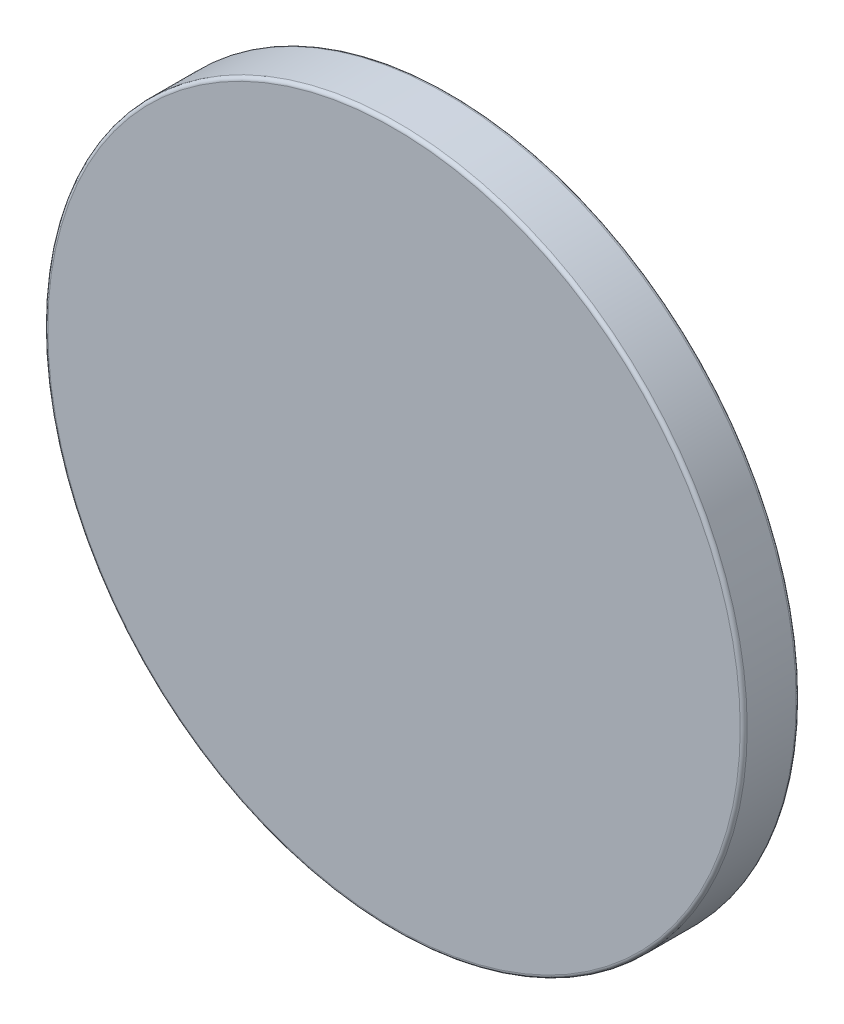
ISO-10303-21;
HEADER;
FILE_DESCRIPTION(('STEP AP214'),'2;1');
FILE_NAME('part.step','',(''),(''),'','','');
FILE_SCHEMA(('AUTOMOTIVE_DESIGN { 1 0 10303 214 1 1 1 1 }'));
ENDSEC;
DATA;
#1=APPLICATION_CONTEXT('core data for automotive mechanical design processes');
#2=APPLICATION_PROTOCOL_DEFINITION('international standard','automotive_design',2000,#1);
#3=PRODUCT_CONTEXT('',#1,'mechanical');
#4=PRODUCT('Part','Part','',(#3));
#5=PRODUCT_RELATED_PRODUCT_CATEGORY('part','',(#4));
#6=PRODUCT_DEFINITION_FORMATION('','',#4);
#7=PRODUCT_DEFINITION_CONTEXT('part definition',#1,'design');
#8=PRODUCT_DEFINITION('design','',#6,#7);
#9=PRODUCT_DEFINITION_SHAPE('','',#8);
#10=(LENGTH_UNIT() NAMED_UNIT(*) SI_UNIT(.MILLI.,.METRE.));
#11=(NAMED_UNIT(*) PLANE_ANGLE_UNIT() SI_UNIT($,.RADIAN.));
#12=(NAMED_UNIT(*) SI_UNIT($,.STERADIAN.) SOLID_ANGLE_UNIT());
#13=UNCERTAINTY_MEASURE_WITH_UNIT(LENGTH_MEASURE(1.E-05),#10,'distance_accuracy_value','');
#14=(GEOMETRIC_REPRESENTATION_CONTEXT(3) GLOBAL_UNCERTAINTY_ASSIGNED_CONTEXT((#13)) GLOBAL_UNIT_ASSIGNED_CONTEXT((#10,
#11,#12)) REPRESENTATION_CONTEXT('',''));
#15=CARTESIAN_POINT('',(0.,0.,0.));
#16=DIRECTION('',(0.,0.,1.));
#17=DIRECTION('',(1.,0.,0.));
#18=AXIS2_PLACEMENT_3D('',#15,#16,#17);
#19=CARTESIAN_POINT('',(0.,0.,1.016));
#20=DIRECTION('',(0.,0.,-1.));
#21=DIRECTION('',(-1.,0.,0.));
#22=AXIS2_PLACEMENT_3D('',#19,#20,#21);
#23=CYLINDRICAL_SURFACE('',#22,12.7);
#24=CARTESIAN_POINT('',(0.,0.,-0.888999999999999));
#25=DIRECTION('',(0.,0.,1.));
#26=DIRECTION('',(1.,0.,0.));
#27=AXIS2_PLACEMENT_3D('',#24,#25,#26);
#28=CIRCLE('',#27,12.7);
#29=CARTESIAN_POINT('',(12.7,0.,-0.888999999999999));
#30=VERTEX_POINT('',#29);
#31=EDGE_CURVE('E46',#30,#30,#28,.T.);
#32=ORIENTED_EDGE('',*,*,#31,.T.);
#33=EDGE_LOOP('',(#32));
#34=FACE_BOUND('',#33,.T.);
#35=CARTESIAN_POINT('',(0.,0.,0.889000000000001));
#36=DIRECTION('',(0.,0.,1.));
#37=DIRECTION('',(1.,0.,0.));
#38=AXIS2_PLACEMENT_3D('',#35,#36,#37);
#39=CIRCLE('',#38,12.7);
#40=CARTESIAN_POINT('',(12.7,0.,0.889000000000001));
#41=VERTEX_POINT('',#40);
#42=EDGE_CURVE('E50',#41,#41,#39,.F.);
#43=ORIENTED_EDGE('',*,*,#42,.T.);
#44=EDGE_LOOP('',(#43));
#45=FACE_BOUND('',#44,.T.);
#46=ADVANCED_FACE('F35',(#34,#45),#23,.T.);
#47=CARTESIAN_POINT('',(0.,0.,1.016));
#48=DIRECTION('',(0.,0.,1.));
#49=DIRECTION('',(1.,0.,0.));
#50=AXIS2_PLACEMENT_3D('',#47,#48,#49);
#51=PLANE('',#50);
#52=CARTESIAN_POINT('',(0.,0.,1.016));
#53=DIRECTION('',(0.,0.,1.));
#54=DIRECTION('',(1.,0.,0.));
#55=AXIS2_PLACEMENT_3D('',#52,#53,#54);
#56=CIRCLE('',#55,12.573);
#57=CARTESIAN_POINT('',(12.573,0.,1.016));
#58=VERTEX_POINT('',#57);
#59=EDGE_CURVE('E10',#58,#58,#56,.T.);
#60=ORIENTED_EDGE('',*,*,#59,.T.);
#61=EDGE_LOOP('',(#60));
#62=FACE_BOUND('',#61,.T.);
#63=ADVANCED_FACE('F66',(#62),#51,.T.);
#64=CARTESIAN_POINT('',(0.,0.,-1.016));
#65=DIRECTION('',(0.,0.,1.));
#66=DIRECTION('',(1.,0.,0.));
#67=AXIS2_PLACEMENT_3D('',#64,#65,#66);
#68=PLANE('',#67);
#69=CARTESIAN_POINT('',(0.,0.,-1.016));
#70=DIRECTION('',(0.,0.,1.));
#71=DIRECTION('',(1.,0.,0.));
#72=AXIS2_PLACEMENT_3D('',#69,#70,#71);
#73=CIRCLE('',#72,12.573);
#74=CARTESIAN_POINT('',(12.573,0.,-1.016));
#75=VERTEX_POINT('',#74);
#76=EDGE_CURVE('E42',#75,#75,#73,.F.);
#77=ORIENTED_EDGE('',*,*,#76,.T.);
#78=EDGE_LOOP('',(#77));
#79=FACE_BOUND('',#78,.T.);
#80=ADVANCED_FACE('F63',(#79),#68,.F.);
#81=CARTESIAN_POINT('',(0.,0.,-0.888999999999999));
#82=DIRECTION('',(0.,0.,1.));
#83=DIRECTION('',(1.,0.,0.));
#84=AXIS2_PLACEMENT_3D('',#81,#82,#83);
#85=TOROIDAL_SURFACE('',#84,12.573,0.127);
#86=ORIENTED_EDGE('',*,*,#76,.F.);
#87=EDGE_LOOP('',(#86));
#88=FACE_BOUND('',#87,.T.);
#89=ORIENTED_EDGE('',*,*,#31,.F.);
#90=EDGE_LOOP('',(#89));
#91=FACE_BOUND('',#90,.T.);
#92=ADVANCED_FACE('F59',(#88,#91),#85,.T.);
#93=CARTESIAN_POINT('',(0.,0.,0.889000000000001));
#94=DIRECTION('',(0.,0.,1.));
#95=DIRECTION('',(1.,0.,0.));
#96=AXIS2_PLACEMENT_3D('',#93,#94,#95);
#97=TOROIDAL_SURFACE('',#96,12.573,0.127);
#98=ORIENTED_EDGE('',*,*,#42,.F.);
#99=EDGE_LOOP('',(#98));
#100=FACE_BOUND('',#99,.T.);
#101=ORIENTED_EDGE('',*,*,#59,.F.);
#102=EDGE_LOOP('',(#101));
#103=FACE_BOUND('',#102,.T.);
#104=ADVANCED_FACE('F37',(#100,#103),#97,.T.);
#105=CLOSED_SHELL('',(#46,#63,#80,#92,#104));
#106=MANIFOLD_SOLID_BREP('B2',#105);
#107=ADVANCED_BREP_SHAPE_REPRESENTATION('',(#18,#106),#14);
#108=SHAPE_DEFINITION_REPRESENTATION(#9,#107);
ENDSEC;
END-ISO-10303-21;
